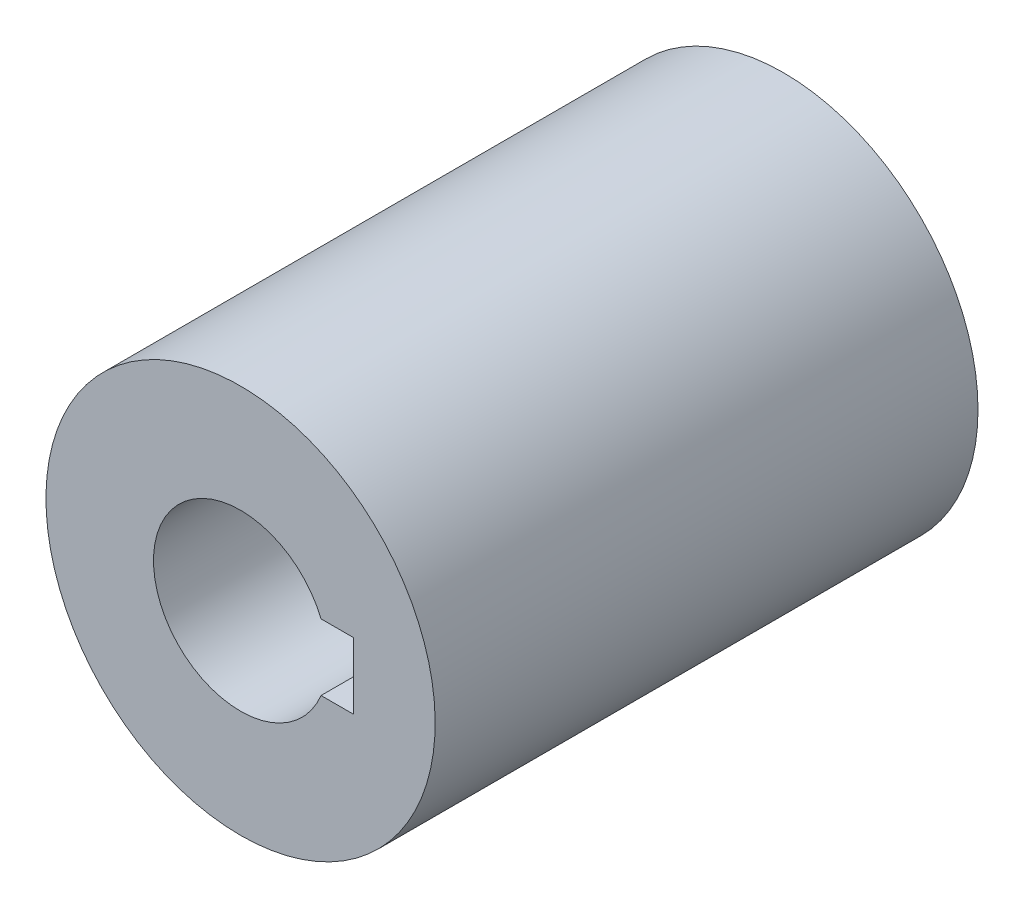
ISO-10303-21;
HEADER;
FILE_DESCRIPTION(('STEP AP214'),'2;1');
FILE_NAME('part.step','',(''),(''),'','','');
FILE_SCHEMA(('AUTOMOTIVE_DESIGN { 1 0 10303 214 1 1 1 1 }'));
ENDSEC;
DATA;
#1=APPLICATION_CONTEXT('core data for automotive mechanical design processes');
#2=APPLICATION_PROTOCOL_DEFINITION('international standard','automotive_design',2000,#1);
#3=PRODUCT_CONTEXT('',#1,'mechanical');
#4=PRODUCT('Part','Part','',(#3));
#5=PRODUCT_RELATED_PRODUCT_CATEGORY('part','',(#4));
#6=PRODUCT_DEFINITION_FORMATION('','',#4);
#7=PRODUCT_DEFINITION_CONTEXT('part definition',#1,'design');
#8=PRODUCT_DEFINITION('design','',#6,#7);
#9=PRODUCT_DEFINITION_SHAPE('','',#8);
#10=(LENGTH_UNIT() NAMED_UNIT(*) SI_UNIT(.MILLI.,.METRE.));
#11=(NAMED_UNIT(*) PLANE_ANGLE_UNIT() SI_UNIT($,.RADIAN.));
#12=(NAMED_UNIT(*) SI_UNIT($,.STERADIAN.) SOLID_ANGLE_UNIT());
#13=UNCERTAINTY_MEASURE_WITH_UNIT(LENGTH_MEASURE(1.E-05),#10,'distance_accuracy_value','');
#14=(GEOMETRIC_REPRESENTATION_CONTEXT(3) GLOBAL_UNCERTAINTY_ASSIGNED_CONTEXT((#13)) GLOBAL_UNIT_ASSIGNED_CONTEXT((#10,
#11,#12)) REPRESENTATION_CONTEXT('',''));
#15=CARTESIAN_POINT('',(0.,0.,0.));
#16=DIRECTION('',(0.,0.,1.));
#17=DIRECTION('',(1.,0.,0.));
#18=AXIS2_PLACEMENT_3D('',#15,#16,#17);
#19=CARTESIAN_POINT('',(-6.5,0.,-47.8700576850888));
#20=DIRECTION('',(-1.,0.,0.));
#21=DIRECTION('',(0.,-1.,0.));
#22=AXIS2_PLACEMENT_3D('',#19,#20,#21);
#23=PLANE('',#22);
#24=DIRECTION('',(0.,0.,1.));
#25=VECTOR('',#24,1.);
#26=CARTESIAN_POINT('',(-6.49999999999996,-3.75277674973265,-47.8700576850888));
#27=LINE('',#26,#25);
#28=CARTESIAN_POINT('',(-6.49999999999996,-3.75277674973265,-16.5));
#29=VERTEX_POINT('',#28);
#30=CARTESIAN_POINT('',(-6.49999999999996,-3.75277674973265,-5.));
#31=VERTEX_POINT('',#30);
#32=EDGE_CURVE('E60',#29,#31,#27,.T.);
#33=ORIENTED_EDGE('',*,*,#32,.F.);
#34=DIRECTION('',(0.,1.,0.));
#35=VECTOR('',#34,1.);
#36=CARTESIAN_POINT('',(-6.50000000000004,3.75277674973251,-16.5));
#37=LINE('',#36,#35);
#38=CARTESIAN_POINT('',(-6.50000000000004,3.75277674973251,-16.5));
#39=VERTEX_POINT('',#38);
#40=EDGE_CURVE('E167',#29,#39,#37,.T.);
#41=ORIENTED_EDGE('',*,*,#40,.T.);
#42=DIRECTION('',(0.,0.,1.));
#43=VECTOR('',#42,1.);
#44=CARTESIAN_POINT('',(-6.50000000000004,3.75277674973251,-47.8700576850888));
#45=LINE('',#44,#43);
#46=CARTESIAN_POINT('',(-6.50000000000004,3.75277674973251,-5.));
#47=VERTEX_POINT('',#46);
#48=EDGE_CURVE('E145',#39,#47,#45,.T.);
#49=ORIENTED_EDGE('',*,*,#48,.T.);
#50=DIRECTION('',(0.,-1.,0.));
#51=VECTOR('',#50,1.);
#52=CARTESIAN_POINT('',(-6.50000000000004,3.75277674973251,-5.));
#53=LINE('',#52,#51);
#54=EDGE_CURVE('E207',#47,#31,#53,.T.);
#55=ORIENTED_EDGE('',*,*,#54,.T.);
#56=EDGE_LOOP('',(#33,#41,#49,#55));
#57=FACE_BOUND('',#56,.T.);
#58=ADVANCED_FACE('F56',(#57),#23,.F.);
#59=CARTESIAN_POINT('',(-3.25000000000005,5.62916512459882,-47.8700576850888));
#60=DIRECTION('',(-0.500000000000007,0.866025403784435,0.));
#61=DIRECTION('',(-0.866025403784435,-0.500000000000007,0.));
#62=AXIS2_PLACEMENT_3D('',#59,#60,#61);
#63=PLANE('',#62);
#64=ORIENTED_EDGE('',*,*,#48,.F.);
#65=DIRECTION('',(0.866025403784435,0.500000000000007,0.));
#66=VECTOR('',#65,1.);
#67=CARTESIAN_POINT('',(0.,7.50555349946514,-16.5));
#68=LINE('',#67,#66);
#69=CARTESIAN_POINT('',(0.,7.50555349946514,-16.5));
#70=VERTEX_POINT('',#69);
#71=EDGE_CURVE('E148',#39,#70,#68,.T.);
#72=ORIENTED_EDGE('',*,*,#71,.T.);
#73=DIRECTION('',(0.,0.,1.));
#74=VECTOR('',#73,1.);
#75=CARTESIAN_POINT('',(0.,7.50555349946514,-47.8700576850888));
#76=LINE('',#75,#74);
#77=CARTESIAN_POINT('',(0.,7.50555349946514,-5.));
#78=VERTEX_POINT('',#77);
#79=EDGE_CURVE('E133',#70,#78,#76,.T.);
#80=ORIENTED_EDGE('',*,*,#79,.T.);
#81=DIRECTION('',(-0.866025403784435,-0.500000000000007,0.));
#82=VECTOR('',#81,1.);
#83=CARTESIAN_POINT('',(0.,7.50555349946514,-5.));
#84=LINE('',#83,#82);
#85=EDGE_CURVE('E221',#78,#47,#84,.T.);
#86=ORIENTED_EDGE('',*,*,#85,.T.);
#87=EDGE_LOOP('',(#64,#72,#80,#86));
#88=FACE_BOUND('',#87,.T.);
#89=ADVANCED_FACE('F149',(#88),#63,.F.);
#90=CARTESIAN_POINT('',(3.24999999999997,5.62916512459887,-47.8700576850888));
#91=DIRECTION('',(0.499999999999995,0.866025403784441,0.));
#92=DIRECTION('',(-0.866025403784442,0.499999999999995,0.));
#93=AXIS2_PLACEMENT_3D('',#90,#91,#92);
#94=PLANE('',#93);
#95=ORIENTED_EDGE('',*,*,#79,.F.);
#96=DIRECTION('',(0.866025403784442,-0.499999999999995,0.));
#97=VECTOR('',#96,1.);
#98=CARTESIAN_POINT('',(6.49999999999999,3.7527767497326,-16.5));
#99=LINE('',#98,#97);
#100=CARTESIAN_POINT('',(6.49999999999999,3.7527767497326,-16.5));
#101=VERTEX_POINT('',#100);
#102=EDGE_CURVE('E137',#70,#101,#99,.T.);
#103=ORIENTED_EDGE('',*,*,#102,.T.);
#104=DIRECTION('',(0.,0.,1.));
#105=VECTOR('',#104,1.);
#106=CARTESIAN_POINT('',(6.49999999999999,3.7527767497326,-47.8700576850888));
#107=LINE('',#106,#105);
#108=CARTESIAN_POINT('',(6.49999999999999,3.7527767497326,-5.));
#109=VERTEX_POINT('',#108);
#110=EDGE_CURVE('E144',#101,#109,#107,.T.);
#111=ORIENTED_EDGE('',*,*,#110,.T.);
#112=DIRECTION('',(-0.866025403784442,0.499999999999995,0.));
#113=VECTOR('',#112,1.);
#114=CARTESIAN_POINT('',(6.49999999999999,3.7527767497326,-5.));
#115=LINE('',#114,#113);
#116=EDGE_CURVE('E140',#109,#78,#115,.T.);
#117=ORIENTED_EDGE('',*,*,#116,.T.);
#118=EDGE_LOOP('',(#95,#103,#111,#117));
#119=FACE_BOUND('',#118,.T.);
#120=ADVANCED_FACE('F135',(#119),#94,.F.);
#121=CARTESIAN_POINT('',(6.5,0.,-47.8700576850888));
#122=DIRECTION('',(1.,0.,0.));
#123=DIRECTION('',(0.,1.,0.));
#124=AXIS2_PLACEMENT_3D('',#121,#122,#123);
#125=PLANE('',#124);
#126=ORIENTED_EDGE('',*,*,#110,.F.);
#127=DIRECTION('',(0.,-1.,0.));
#128=VECTOR('',#127,1.);
#129=CARTESIAN_POINT('',(6.50000000000001,-3.75277674973256,-16.5));
#130=LINE('',#129,#128);
#131=CARTESIAN_POINT('',(6.50000000000001,-3.75277674973256,-16.5));
#132=VERTEX_POINT('',#131);
#133=EDGE_CURVE('E157',#101,#132,#130,.T.);
#134=ORIENTED_EDGE('',*,*,#133,.T.);
#135=DIRECTION('',(0.,0.,1.));
#136=VECTOR('',#135,1.);
#137=CARTESIAN_POINT('',(6.50000000000001,-3.75277674973256,-47.8700576850888));
#138=LINE('',#137,#136);
#139=CARTESIAN_POINT('',(6.50000000000001,-3.75277674973256,-5.));
#140=VERTEX_POINT('',#139);
#141=EDGE_CURVE('E65',#132,#140,#138,.T.);
#142=ORIENTED_EDGE('',*,*,#141,.T.);
#143=DIRECTION('',(0.,1.,0.));
#144=VECTOR('',#143,1.);
#145=CARTESIAN_POINT('',(6.50000000000001,-3.75277674973256,-5.));
#146=LINE('',#145,#144);
#147=EDGE_CURVE('E217',#140,#109,#146,.T.);
#148=ORIENTED_EDGE('',*,*,#147,.T.);
#149=EDGE_LOOP('',(#126,#134,#142,#148));
#150=FACE_BOUND('',#149,.T.);
#151=ADVANCED_FACE('F236',(#150),#125,.F.);
#152=CARTESIAN_POINT('',(3.25000000000001,-5.62916512459885,-47.8700576850888));
#153=DIRECTION('',(0.500000000000001,-0.866025403784438,0.));
#154=DIRECTION('',(0.866025403784438,0.500000000000001,0.));
#155=AXIS2_PLACEMENT_3D('',#152,#153,#154);
#156=PLANE('',#155);
#157=ORIENTED_EDGE('',*,*,#141,.F.);
#158=DIRECTION('',(-0.866025403784438,-0.500000000000001,0.));
#159=VECTOR('',#158,1.);
#160=CARTESIAN_POINT('',(0.,-7.50555349946514,-16.5));
#161=LINE('',#160,#159);
#162=CARTESIAN_POINT('',(0.,-7.50555349946514,-16.5));
#163=VERTEX_POINT('',#162);
#164=EDGE_CURVE('E159',#132,#163,#161,.T.);
#165=ORIENTED_EDGE('',*,*,#164,.T.);
#166=DIRECTION('',(0.,0.,1.));
#167=VECTOR('',#166,1.);
#168=CARTESIAN_POINT('',(0.,-7.50555349946514,-47.8700576850888));
#169=LINE('',#168,#167);
#170=CARTESIAN_POINT('',(0.,-7.50555349946514,-5.));
#171=VERTEX_POINT('',#170);
#172=EDGE_CURVE('E12',#163,#171,#169,.T.);
#173=ORIENTED_EDGE('',*,*,#172,.T.);
#174=DIRECTION('',(0.866025403784438,0.500000000000001,0.));
#175=VECTOR('',#174,1.);
#176=CARTESIAN_POINT('',(0.,-7.50555349946514,-5.));
#177=LINE('',#176,#175);
#178=EDGE_CURVE('E214',#171,#140,#177,.T.);
#179=ORIENTED_EDGE('',*,*,#178,.T.);
#180=EDGE_LOOP('',(#157,#165,#173,#179));
#181=FACE_BOUND('',#180,.T.);
#182=ADVANCED_FACE('F234',(#181),#156,.F.);
#183=CARTESIAN_POINT('',(-3.24999999999998,-5.62916512459889,-47.8700576850888));
#184=DIRECTION('',(-0.499999999999995,-0.866025403784441,0.));
#185=DIRECTION('',(0.866025403784441,-0.499999999999995,0.));
#186=AXIS2_PLACEMENT_3D('',#183,#184,#185);
#187=PLANE('',#186);
#188=ORIENTED_EDGE('',*,*,#172,.F.);
#189=DIRECTION('',(-0.866025403784441,0.499999999999995,0.));
#190=VECTOR('',#189,1.);
#191=CARTESIAN_POINT('',(-6.49999999999996,-3.75277674973265,-16.5));
#192=LINE('',#191,#190);
#193=EDGE_CURVE('E164',#163,#29,#192,.T.);
#194=ORIENTED_EDGE('',*,*,#193,.T.);
#195=ORIENTED_EDGE('',*,*,#32,.T.);
#196=DIRECTION('',(0.866025403784441,-0.499999999999995,0.));
#197=VECTOR('',#196,1.);
#198=CARTESIAN_POINT('',(-6.49999999999996,-3.75277674973265,-5.));
#199=LINE('',#198,#197);
#200=EDGE_CURVE('E211',#31,#171,#199,.T.);
#201=ORIENTED_EDGE('',*,*,#200,.T.);
#202=EDGE_LOOP('',(#188,#194,#195,#201));
#203=FACE_BOUND('',#202,.T.);
#204=ADVANCED_FACE('F58',(#203),#187,.F.);
#205=CARTESIAN_POINT('',(0.,0.,-47.8700576850888));
#206=DIRECTION('',(0.,0.,1.));
#207=DIRECTION('',(1.,0.,0.));
#208=AXIS2_PLACEMENT_3D('',#205,#206,#207);
#209=CYLINDRICAL_SURFACE('',#208,9.5);
#210=CARTESIAN_POINT('',(0.,0.,10.));
#211=DIRECTION('',(0.,0.,1.));
#212=DIRECTION('',(0.,-1.,0.));
#213=AXIS2_PLACEMENT_3D('',#210,#211,#212);
#214=CIRCLE('',#213,9.5);
#215=CARTESIAN_POINT('',(0.,-9.5,10.));
#216=VERTEX_POINT('',#215);
#217=EDGE_CURVE('E183',#216,#216,#214,.T.);
#218=ORIENTED_EDGE('',*,*,#217,.F.);
#219=EDGE_LOOP('',(#218));
#220=FACE_BOUND('',#219,.T.);
#221=CARTESIAN_POINT('',(0.,0.,-16.5));
#222=DIRECTION('',(0.,0.,-1.));
#223=DIRECTION('',(-1.,0.,0.));
#224=AXIS2_PLACEMENT_3D('',#221,#222,#223);
#225=CIRCLE('',#224,9.5);
#226=CARTESIAN_POINT('',(-9.5,0.,-16.5));
#227=VERTEX_POINT('',#226);
#228=EDGE_CURVE('E169',#227,#227,#225,.T.);
#229=ORIENTED_EDGE('',*,*,#228,.F.);
#230=EDGE_LOOP('',(#229));
#231=FACE_BOUND('',#230,.T.);
#232=ADVANCED_FACE('F278',(#220,#231),#209,.T.);
#233=CARTESIAN_POINT('',(0.,0.,0.));
#234=DIRECTION('',(0.,0.,1.));
#235=DIRECTION('',(1.,0.,0.));
#236=AXIS2_PLACEMENT_3D('',#233,#234,#235);
#237=PLANE('',#236);
#238=DIRECTION('',(1.,0.,0.));
#239=VECTOR('',#238,1.);
#240=CARTESIAN_POINT('',(0.,1.62000000000003,0.));
#241=LINE('',#240,#239);
#242=CARTESIAN_POINT('',(3.92913476480509,1.62000000000003,0.));
#243=VERTEX_POINT('',#242);
#244=CARTESIAN_POINT('',(5.52,1.62000000000003,0.));
#245=VERTEX_POINT('',#244);
#246=EDGE_CURVE('E180',#243,#245,#241,.T.);
#247=ORIENTED_EDGE('',*,*,#246,.F.);
#248=CARTESIAN_POINT('',(0.,0.,0.));
#249=DIRECTION('',(0.,0.,1.));
#250=DIRECTION('',(1.,0.,0.));
#251=AXIS2_PLACEMENT_3D('',#248,#249,#250);
#252=CIRCLE('',#251,4.25);
#253=CARTESIAN_POINT('',(3.92913476480511,-1.61999999999997,0.));
#254=VERTEX_POINT('',#253);
#255=EDGE_CURVE('E78',#254,#243,#252,.T.);
#256=ORIENTED_EDGE('',*,*,#255,.F.);
#257=DIRECTION('',(-1.,0.,0.));
#258=VECTOR('',#257,1.);
#259=CARTESIAN_POINT('',(0.,-1.61999999999997,0.));
#260=LINE('',#259,#258);
#261=CARTESIAN_POINT('',(5.52,-1.61999999999997,0.));
#262=VERTEX_POINT('',#261);
#263=EDGE_CURVE('E173',#262,#254,#260,.T.);
#264=ORIENTED_EDGE('',*,*,#263,.F.);
#265=DIRECTION('',(0.,-1.,0.));
#266=VECTOR('',#265,1.);
#267=CARTESIAN_POINT('',(5.52,0.,0.));
#268=LINE('',#267,#266);
#269=EDGE_CURVE('E73',#245,#262,#268,.T.);
#270=ORIENTED_EDGE('',*,*,#269,.F.);
#271=EDGE_LOOP('',(#247,#256,#264,#270));
#272=FACE_BOUND('',#271,.T.);
#273=ADVANCED_FACE('F287',(#272),#237,.T.);
#274=CARTESIAN_POINT('',(0.,0.,-5.));
#275=DIRECTION('',(0.,0.,1.));
#276=DIRECTION('',(1.,0.,0.));
#277=AXIS2_PLACEMENT_3D('',#274,#275,#276);
#278=PLANE('',#277);
#279=CARTESIAN_POINT('',(0.,0.,-5.));
#280=DIRECTION('',(0.,0.,1.));
#281=DIRECTION('',(1.,0.,0.));
#282=AXIS2_PLACEMENT_3D('',#279,#280,#281);
#283=CIRCLE('',#282,4.25);
#284=CARTESIAN_POINT('',(4.25,0.,-5.));
#285=VERTEX_POINT('',#284);
#286=EDGE_CURVE('E204',#285,#285,#283,.T.);
#287=ORIENTED_EDGE('',*,*,#286,.T.);
#288=EDGE_LOOP('',(#287));
#289=FACE_BOUND('',#288,.T.);
#290=ORIENTED_EDGE('',*,*,#54,.F.);
#291=ORIENTED_EDGE('',*,*,#85,.F.);
#292=ORIENTED_EDGE('',*,*,#116,.F.);
#293=ORIENTED_EDGE('',*,*,#147,.F.);
#294=ORIENTED_EDGE('',*,*,#178,.F.);
#295=ORIENTED_EDGE('',*,*,#200,.F.);
#296=EDGE_LOOP('',(#290,#291,#292,#293,#294,#295));
#297=FACE_BOUND('',#296,.T.);
#298=ADVANCED_FACE('F231',(#289,#297),#278,.F.);
#299=CARTESIAN_POINT('',(0.,0.,-5.));
#300=DIRECTION('',(0.,0.,1.));
#301=DIRECTION('',(1.,0.,0.));
#302=AXIS2_PLACEMENT_3D('',#299,#300,#301);
#303=CYLINDRICAL_SURFACE('',#302,4.25);
#304=ORIENTED_EDGE('',*,*,#286,.F.);
#305=EDGE_LOOP('',(#304));
#306=FACE_BOUND('',#305,.T.);
#307=ORIENTED_EDGE('',*,*,#255,.T.);
#308=DIRECTION('',(0.,0.,-1.));
#309=VECTOR('',#308,1.);
#310=CARTESIAN_POINT('',(3.92913476480509,1.62000000000003,36.8700576850888));
#311=LINE('',#310,#309);
#312=CARTESIAN_POINT('',(3.92913476480509,1.62000000000003,10.));
#313=VERTEX_POINT('',#312);
#314=EDGE_CURVE('E172',#313,#243,#311,.T.);
#315=ORIENTED_EDGE('',*,*,#314,.F.);
#316=CARTESIAN_POINT('',(0.,0.,10.));
#317=DIRECTION('',(0.,0.,1.));
#318=DIRECTION('',(0.,-1.,0.));
#319=AXIS2_PLACEMENT_3D('',#316,#317,#318);
#320=CIRCLE('',#319,4.25);
#321=CARTESIAN_POINT('',(3.92913476480511,-1.61999999999997,10.));
#322=VERTEX_POINT('',#321);
#323=EDGE_CURVE('E195',#322,#313,#320,.F.);
#324=ORIENTED_EDGE('',*,*,#323,.F.);
#325=DIRECTION('',(0.,0.,-1.));
#326=VECTOR('',#325,1.);
#327=CARTESIAN_POINT('',(3.92913476480511,-1.61999999999997,36.8700576850888));
#328=LINE('',#327,#326);
#329=EDGE_CURVE('E176',#322,#254,#328,.T.);
#330=ORIENTED_EDGE('',*,*,#329,.T.);
#331=EDGE_LOOP('',(#307,#315,#324,#330));
#332=FACE_BOUND('',#331,.T.);
#333=ADVANCED_FACE('F332',(#306,#332),#303,.F.);
#334=CARTESIAN_POINT('',(0.,1.62000000000003,36.8700576850888));
#335=DIRECTION('',(0.,1.,0.));
#336=DIRECTION('',(0.,0.,1.));
#337=AXIS2_PLACEMENT_3D('',#334,#335,#336);
#338=PLANE('',#337);
#339=DIRECTION('',(1.,0.,0.));
#340=VECTOR('',#339,1.);
#341=CARTESIAN_POINT('',(0.,1.62000000000003,10.));
#342=LINE('',#341,#340);
#343=CARTESIAN_POINT('',(5.52,1.62000000000003,10.));
#344=VERTEX_POINT('',#343);
#345=EDGE_CURVE('E192',#313,#344,#342,.T.);
#346=ORIENTED_EDGE('',*,*,#345,.F.);
#347=ORIENTED_EDGE('',*,*,#314,.T.);
#348=ORIENTED_EDGE('',*,*,#246,.T.);
#349=DIRECTION('',(0.,0.,-1.));
#350=VECTOR('',#349,1.);
#351=CARTESIAN_POINT('',(5.52,1.62000000000003,36.8700576850888));
#352=LINE('',#351,#350);
#353=EDGE_CURVE('E179',#344,#245,#352,.T.);
#354=ORIENTED_EDGE('',*,*,#353,.F.);
#355=EDGE_LOOP('',(#346,#347,#348,#354));
#356=FACE_BOUND('',#355,.T.);
#357=ADVANCED_FACE('F324',(#356),#338,.F.);
#358=CARTESIAN_POINT('',(5.52,0.,36.8700576850888));
#359=DIRECTION('',(1.,0.,0.));
#360=DIRECTION('',(0.,0.,-1.));
#361=AXIS2_PLACEMENT_3D('',#358,#359,#360);
#362=PLANE('',#361);
#363=DIRECTION('',(0.,-1.,0.));
#364=VECTOR('',#363,1.);
#365=CARTESIAN_POINT('',(5.52,0.,10.));
#366=LINE('',#365,#364);
#367=CARTESIAN_POINT('',(5.52,-1.61999999999997,10.));
#368=VERTEX_POINT('',#367);
#369=EDGE_CURVE('E189',#344,#368,#366,.T.);
#370=ORIENTED_EDGE('',*,*,#369,.F.);
#371=ORIENTED_EDGE('',*,*,#353,.T.);
#372=ORIENTED_EDGE('',*,*,#269,.T.);
#373=DIRECTION('',(0.,0.,-1.));
#374=VECTOR('',#373,1.);
#375=CARTESIAN_POINT('',(5.52,-1.61999999999997,36.8700576850888));
#376=LINE('',#375,#374);
#377=EDGE_CURVE('E177',#368,#262,#376,.T.);
#378=ORIENTED_EDGE('',*,*,#377,.F.);
#379=EDGE_LOOP('',(#370,#371,#372,#378));
#380=FACE_BOUND('',#379,.T.);
#381=ADVANCED_FACE('F316',(#380),#362,.F.);
#382=CARTESIAN_POINT('',(0.,-1.61999999999997,36.8700576850888));
#383=DIRECTION('',(0.,-1.,0.));
#384=DIRECTION('',(1.,0.,0.));
#385=AXIS2_PLACEMENT_3D('',#382,#383,#384);
#386=PLANE('',#385);
#387=DIRECTION('',(-1.,0.,0.));
#388=VECTOR('',#387,1.);
#389=CARTESIAN_POINT('',(0.,-1.61999999999997,10.));
#390=LINE('',#389,#388);
#391=EDGE_CURVE('E186',#368,#322,#390,.T.);
#392=ORIENTED_EDGE('',*,*,#391,.F.);
#393=ORIENTED_EDGE('',*,*,#377,.T.);
#394=ORIENTED_EDGE('',*,*,#263,.T.);
#395=ORIENTED_EDGE('',*,*,#329,.F.);
#396=EDGE_LOOP('',(#392,#393,#394,#395));
#397=FACE_BOUND('',#396,.T.);
#398=ADVANCED_FACE('F308',(#397),#386,.F.);
#399=CARTESIAN_POINT('',(0.,0.,10.));
#400=DIRECTION('',(0.,0.,1.));
#401=DIRECTION('',(0.,-1.,0.));
#402=AXIS2_PLACEMENT_3D('',#399,#400,#401);
#403=PLANE('',#402);
#404=ORIENTED_EDGE('',*,*,#323,.T.);
#405=ORIENTED_EDGE('',*,*,#345,.T.);
#406=ORIENTED_EDGE('',*,*,#369,.T.);
#407=ORIENTED_EDGE('',*,*,#391,.T.);
#408=EDGE_LOOP('',(#404,#405,#406,#407));
#409=FACE_BOUND('',#408,.T.);
#410=ORIENTED_EDGE('',*,*,#217,.T.);
#411=EDGE_LOOP('',(#410));
#412=FACE_BOUND('',#411,.T.);
#413=ADVANCED_FACE('F298',(#409,#412),#403,.T.);
#414=CARTESIAN_POINT('',(0.,0.,-16.5));
#415=DIRECTION('',(0.,0.,-1.));
#416=DIRECTION('',(-1.,0.,0.));
#417=AXIS2_PLACEMENT_3D('',#414,#415,#416);
#418=PLANE('',#417);
#419=ORIENTED_EDGE('',*,*,#228,.T.);
#420=EDGE_LOOP('',(#419));
#421=FACE_BOUND('',#420,.T.);
#422=ORIENTED_EDGE('',*,*,#102,.F.);
#423=ORIENTED_EDGE('',*,*,#71,.F.);
#424=ORIENTED_EDGE('',*,*,#40,.F.);
#425=ORIENTED_EDGE('',*,*,#193,.F.);
#426=ORIENTED_EDGE('',*,*,#164,.F.);
#427=ORIENTED_EDGE('',*,*,#133,.F.);
#428=EDGE_LOOP('',(#422,#423,#424,#425,#426,#427));
#429=FACE_BOUND('',#428,.T.);
#430=ADVANCED_FACE('F154',(#421,#429),#418,.T.);
#431=CLOSED_SHELL('',(#58,#89,#120,#151,#182,#204,#232,#273,#298,#333,#357,#381,#398,#413,#430));
#432=MANIFOLD_SOLID_BREP('B2',#431);
#433=ADVANCED_BREP_SHAPE_REPRESENTATION('',(#18,#432),#14);
#434=SHAPE_DEFINITION_REPRESENTATION(#9,#433);
ENDSEC;
END-ISO-10303-21;
